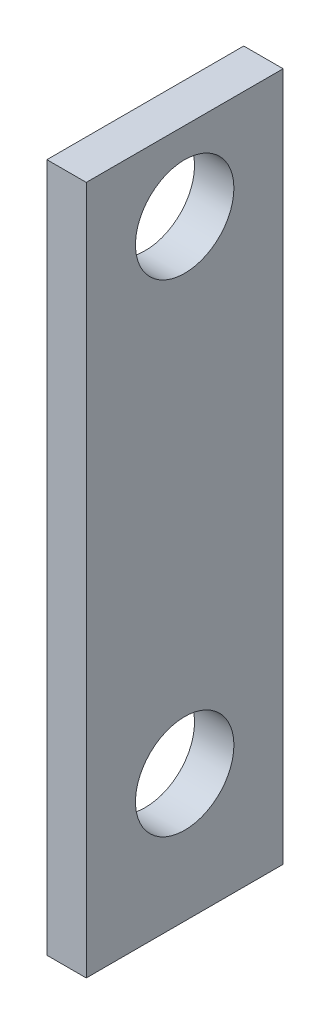
ISO-10303-21;
HEADER;
FILE_DESCRIPTION(('STEP AP214'),'2;1');
FILE_NAME('part.step','',(''),(''),'','','');
FILE_SCHEMA(('AUTOMOTIVE_DESIGN { 1 0 10303 214 1 1 1 1 }'));
ENDSEC;
DATA;
#1=APPLICATION_CONTEXT('core data for automotive mechanical design processes');
#2=APPLICATION_PROTOCOL_DEFINITION('international standard','automotive_design',2000,#1);
#3=PRODUCT_CONTEXT('',#1,'mechanical');
#4=PRODUCT('Part','Part','',(#3));
#5=PRODUCT_RELATED_PRODUCT_CATEGORY('part','',(#4));
#6=PRODUCT_DEFINITION_FORMATION('','',#4);
#7=PRODUCT_DEFINITION_CONTEXT('part definition',#1,'design');
#8=PRODUCT_DEFINITION('design','',#6,#7);
#9=PRODUCT_DEFINITION_SHAPE('','',#8);
#10=(LENGTH_UNIT() NAMED_UNIT(*) SI_UNIT(.MILLI.,.METRE.));
#11=(NAMED_UNIT(*) PLANE_ANGLE_UNIT() SI_UNIT($,.RADIAN.));
#12=(NAMED_UNIT(*) SI_UNIT($,.STERADIAN.) SOLID_ANGLE_UNIT());
#13=UNCERTAINTY_MEASURE_WITH_UNIT(LENGTH_MEASURE(1.E-05),#10,'distance_accuracy_value','');
#14=(GEOMETRIC_REPRESENTATION_CONTEXT(3) GLOBAL_UNCERTAINTY_ASSIGNED_CONTEXT((#13)) GLOBAL_UNIT_ASSIGNED_CONTEXT((#10,
#11,#12)) REPRESENTATION_CONTEXT('',''));
#15=CARTESIAN_POINT('',(0.,0.,0.));
#16=DIRECTION('',(0.,0.,1.));
#17=DIRECTION('',(1.,0.,0.));
#18=AXIS2_PLACEMENT_3D('',#15,#16,#17);
#19=CARTESIAN_POINT('',(2.,-17.5,5.));
#20=DIRECTION('',(0.,0.,-1.));
#21=DIRECTION('',(0.,1.,0.));
#22=AXIS2_PLACEMENT_3D('',#19,#20,#21);
#23=PLANE('',#22);
#24=DIRECTION('',(0.,-1.,0.));
#25=VECTOR('',#24,1.);
#26=CARTESIAN_POINT('',(0.,-17.5,5.));
#27=LINE('',#26,#25);
#28=CARTESIAN_POINT('',(0.,17.5,5.));
#29=VERTEX_POINT('',#28);
#30=CARTESIAN_POINT('',(0.,-17.5,5.));
#31=VERTEX_POINT('',#30);
#32=EDGE_CURVE('E96',#29,#31,#27,.T.);
#33=ORIENTED_EDGE('',*,*,#32,.T.);
#34=DIRECTION('',(-1.,0.,0.));
#35=VECTOR('',#34,1.);
#36=CARTESIAN_POINT('',(2.,-17.5,5.));
#37=LINE('',#36,#35);
#38=CARTESIAN_POINT('',(2.,-17.5,5.));
#39=VERTEX_POINT('',#38);
#40=EDGE_CURVE('E11',#39,#31,#37,.T.);
#41=ORIENTED_EDGE('',*,*,#40,.F.);
#42=DIRECTION('',(0.,-1.,0.));
#43=VECTOR('',#42,1.);
#44=CARTESIAN_POINT('',(2.,-17.5,5.));
#45=LINE('',#44,#43);
#46=CARTESIAN_POINT('',(2.,17.5,5.));
#47=VERTEX_POINT('',#46);
#48=EDGE_CURVE('E84',#47,#39,#45,.T.);
#49=ORIENTED_EDGE('',*,*,#48,.F.);
#50=DIRECTION('',(-1.,0.,0.));
#51=VECTOR('',#50,1.);
#52=CARTESIAN_POINT('',(2.,17.5,5.));
#53=LINE('',#52,#51);
#54=EDGE_CURVE('E92',#47,#29,#53,.T.);
#55=ORIENTED_EDGE('',*,*,#54,.T.);
#56=EDGE_LOOP('',(#33,#41,#49,#55));
#57=FACE_BOUND('',#56,.T.);
#58=ADVANCED_FACE('F33',(#57),#23,.F.);
#59=CARTESIAN_POINT('',(2.,-17.5,-5.));
#60=DIRECTION('',(0.,1.,0.));
#61=DIRECTION('',(0.,0.,1.));
#62=AXIS2_PLACEMENT_3D('',#59,#60,#61);
#63=PLANE('',#62);
#64=DIRECTION('',(0.,0.,-1.));
#65=VECTOR('',#64,1.);
#66=CARTESIAN_POINT('',(0.,-17.5,-5.));
#67=LINE('',#66,#65);
#68=CARTESIAN_POINT('',(0.,-17.5,-5.));
#69=VERTEX_POINT('',#68);
#70=EDGE_CURVE('E88',#31,#69,#67,.T.);
#71=ORIENTED_EDGE('',*,*,#70,.T.);
#72=DIRECTION('',(-1.,0.,0.));
#73=VECTOR('',#72,1.);
#74=CARTESIAN_POINT('',(2.,-17.5,-5.));
#75=LINE('',#74,#73);
#76=CARTESIAN_POINT('',(2.,-17.5,-5.));
#77=VERTEX_POINT('',#76);
#78=EDGE_CURVE('E41',#77,#69,#75,.T.);
#79=ORIENTED_EDGE('',*,*,#78,.F.);
#80=DIRECTION('',(0.,0.,-1.));
#81=VECTOR('',#80,1.);
#82=CARTESIAN_POINT('',(2.,-17.5,-5.));
#83=LINE('',#82,#81);
#84=EDGE_CURVE('E79',#39,#77,#83,.T.);
#85=ORIENTED_EDGE('',*,*,#84,.F.);
#86=ORIENTED_EDGE('',*,*,#40,.T.);
#87=EDGE_LOOP('',(#71,#79,#85,#86));
#88=FACE_BOUND('',#87,.T.);
#89=ADVANCED_FACE('F87',(#88),#63,.F.);
#90=CARTESIAN_POINT('',(2.,-17.5,-5.));
#91=DIRECTION('',(0.,0.,1.));
#92=DIRECTION('',(0.,-1.,0.));
#93=AXIS2_PLACEMENT_3D('',#90,#91,#92);
#94=PLANE('',#93);
#95=DIRECTION('',(0.,1.,0.));
#96=VECTOR('',#95,1.);
#97=CARTESIAN_POINT('',(0.,-17.5,-5.));
#98=LINE('',#97,#96);
#99=CARTESIAN_POINT('',(0.,17.5,-5.));
#100=VERTEX_POINT('',#99);
#101=EDGE_CURVE('E66',#69,#100,#98,.T.);
#102=ORIENTED_EDGE('',*,*,#101,.T.);
#103=DIRECTION('',(-1.,0.,0.));
#104=VECTOR('',#103,1.);
#105=CARTESIAN_POINT('',(2.,17.5,-5.));
#106=LINE('',#105,#104);
#107=CARTESIAN_POINT('',(2.,17.5,-5.));
#108=VERTEX_POINT('',#107);
#109=EDGE_CURVE('E89',#108,#100,#106,.T.);
#110=ORIENTED_EDGE('',*,*,#109,.F.);
#111=DIRECTION('',(0.,1.,0.));
#112=VECTOR('',#111,1.);
#113=CARTESIAN_POINT('',(2.,-17.5,-5.));
#114=LINE('',#113,#112);
#115=EDGE_CURVE('E82',#77,#108,#114,.T.);
#116=ORIENTED_EDGE('',*,*,#115,.F.);
#117=ORIENTED_EDGE('',*,*,#78,.T.);
#118=EDGE_LOOP('',(#102,#110,#116,#117));
#119=FACE_BOUND('',#118,.T.);
#120=ADVANCED_FACE('F90',(#119),#94,.F.);
#121=CARTESIAN_POINT('',(2.,17.5,-5.));
#122=DIRECTION('',(0.,-1.,0.));
#123=DIRECTION('',(0.,0.,-1.));
#124=AXIS2_PLACEMENT_3D('',#121,#122,#123);
#125=PLANE('',#124);
#126=DIRECTION('',(0.,0.,1.));
#127=VECTOR('',#126,1.);
#128=CARTESIAN_POINT('',(0.,17.5,-5.));
#129=LINE('',#128,#127);
#130=EDGE_CURVE('E72',#100,#29,#129,.T.);
#131=ORIENTED_EDGE('',*,*,#130,.T.);
#132=ORIENTED_EDGE('',*,*,#54,.F.);
#133=DIRECTION('',(0.,0.,1.));
#134=VECTOR('',#133,1.);
#135=CARTESIAN_POINT('',(2.,17.5,-5.));
#136=LINE('',#135,#134);
#137=EDGE_CURVE('E49',#108,#47,#136,.T.);
#138=ORIENTED_EDGE('',*,*,#137,.F.);
#139=ORIENTED_EDGE('',*,*,#109,.T.);
#140=EDGE_LOOP('',(#131,#132,#138,#139));
#141=FACE_BOUND('',#140,.T.);
#142=ADVANCED_FACE('F104',(#141),#125,.F.);
#143=CARTESIAN_POINT('',(2.,0.,0.));
#144=DIRECTION('',(1.,0.,0.));
#145=DIRECTION('',(0.,0.,-1.));
#146=AXIS2_PLACEMENT_3D('',#143,#144,#145);
#147=PLANE('',#146);
#148=CARTESIAN_POINT('',(2.,-11.,0.));
#149=DIRECTION('',(1.,0.,0.));
#150=DIRECTION('',(0.,0.,-1.));
#151=AXIS2_PLACEMENT_3D('',#148,#149,#150);
#152=CIRCLE('',#151,2.5);
#153=CARTESIAN_POINT('',(2.,-11.,-2.5));
#154=VERTEX_POINT('',#153);
#155=EDGE_CURVE('E116',#154,#154,#152,.T.);
#156=ORIENTED_EDGE('',*,*,#155,.F.);
#157=EDGE_LOOP('',(#156));
#158=FACE_BOUND('',#157,.T.);
#159=CARTESIAN_POINT('',(2.,13.5,0.));
#160=DIRECTION('',(1.,0.,0.));
#161=DIRECTION('',(0.,0.,-1.));
#162=AXIS2_PLACEMENT_3D('',#159,#160,#161);
#163=CIRCLE('',#162,2.5);
#164=CARTESIAN_POINT('',(2.,13.5,-2.5));
#165=VERTEX_POINT('',#164);
#166=EDGE_CURVE('E110',#165,#165,#163,.T.);
#167=ORIENTED_EDGE('',*,*,#166,.F.);
#168=EDGE_LOOP('',(#167));
#169=FACE_BOUND('',#168,.T.);
#170=ORIENTED_EDGE('',*,*,#48,.T.);
#171=ORIENTED_EDGE('',*,*,#84,.T.);
#172=ORIENTED_EDGE('',*,*,#115,.T.);
#173=ORIENTED_EDGE('',*,*,#137,.T.);
#174=EDGE_LOOP('',(#170,#171,#172,#173));
#175=FACE_BOUND('',#174,.T.);
#176=ADVANCED_FACE('F80',(#158,#169,#175),#147,.T.);
#177=CARTESIAN_POINT('',(0.,0.,0.));
#178=DIRECTION('',(1.,0.,0.));
#179=DIRECTION('',(0.,0.,-1.));
#180=AXIS2_PLACEMENT_3D('',#177,#178,#179);
#181=PLANE('',#180);
#182=CARTESIAN_POINT('',(0.,-11.,0.));
#183=DIRECTION('',(1.,0.,0.));
#184=DIRECTION('',(0.,0.,-1.));
#185=AXIS2_PLACEMENT_3D('',#182,#183,#184);
#186=CIRCLE('',#185,2.5);
#187=CARTESIAN_POINT('',(0.,-11.,-2.5));
#188=VERTEX_POINT('',#187);
#189=EDGE_CURVE('E113',#188,#188,#186,.T.);
#190=ORIENTED_EDGE('',*,*,#189,.T.);
#191=EDGE_LOOP('',(#190));
#192=FACE_BOUND('',#191,.T.);
#193=CARTESIAN_POINT('',(0.,13.5,0.));
#194=DIRECTION('',(1.,0.,0.));
#195=DIRECTION('',(0.,0.,-1.));
#196=AXIS2_PLACEMENT_3D('',#193,#194,#195);
#197=CIRCLE('',#196,2.5);
#198=CARTESIAN_POINT('',(0.,13.5,-2.5));
#199=VERTEX_POINT('',#198);
#200=EDGE_CURVE('E99',#199,#199,#197,.T.);
#201=ORIENTED_EDGE('',*,*,#200,.T.);
#202=EDGE_LOOP('',(#201));
#203=FACE_BOUND('',#202,.T.);
#204=ORIENTED_EDGE('',*,*,#32,.F.);
#205=ORIENTED_EDGE('',*,*,#130,.F.);
#206=ORIENTED_EDGE('',*,*,#101,.F.);
#207=ORIENTED_EDGE('',*,*,#70,.F.);
#208=EDGE_LOOP('',(#204,#205,#206,#207));
#209=FACE_BOUND('',#208,.T.);
#210=ADVANCED_FACE('F107',(#192,#203,#209),#181,.F.);
#211=CARTESIAN_POINT('',(0.,13.5,0.));
#212=DIRECTION('',(1.,0.,0.));
#213=DIRECTION('',(0.,0.,-1.));
#214=AXIS2_PLACEMENT_3D('',#211,#212,#213);
#215=CYLINDRICAL_SURFACE('',#214,2.5);
#216=ORIENTED_EDGE('',*,*,#200,.F.);
#217=EDGE_LOOP('',(#216));
#218=FACE_BOUND('',#217,.T.);
#219=ORIENTED_EDGE('',*,*,#166,.T.);
#220=EDGE_LOOP('',(#219));
#221=FACE_BOUND('',#220,.T.);
#222=ADVANCED_FACE('F127',(#218,#221),#215,.F.);
#223=CARTESIAN_POINT('',(0.,-11.,0.));
#224=DIRECTION('',(1.,0.,0.));
#225=DIRECTION('',(0.,0.,-1.));
#226=AXIS2_PLACEMENT_3D('',#223,#224,#225);
#227=CYLINDRICAL_SURFACE('',#226,2.5);
#228=ORIENTED_EDGE('',*,*,#189,.F.);
#229=EDGE_LOOP('',(#228));
#230=FACE_BOUND('',#229,.T.);
#231=ORIENTED_EDGE('',*,*,#155,.T.);
#232=EDGE_LOOP('',(#231));
#233=FACE_BOUND('',#232,.T.);
#234=ADVANCED_FACE('F124',(#230,#233),#227,.F.);
#235=CLOSED_SHELL('',(#58,#89,#120,#142,#176,#210,#222,#234));
#236=MANIFOLD_SOLID_BREP('B2',#235);
#237=ADVANCED_BREP_SHAPE_REPRESENTATION('',(#18,#236),#14);
#238=SHAPE_DEFINITION_REPRESENTATION(#9,#237);
ENDSEC;
END-ISO-10303-21;
